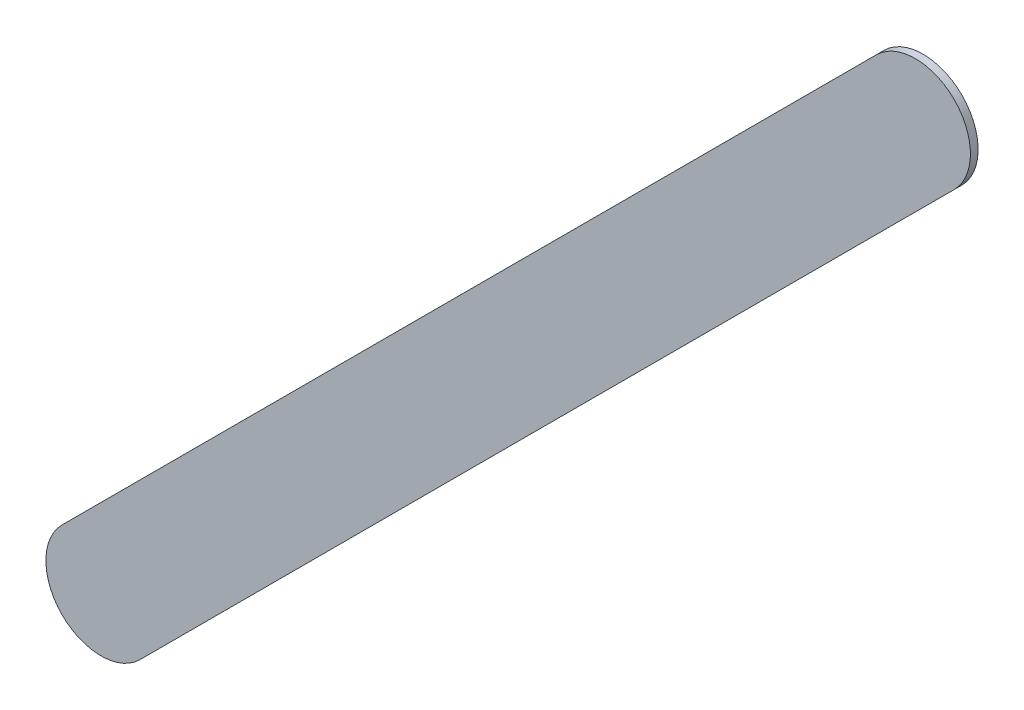
ISO-10303-21;
HEADER;
FILE_DESCRIPTION(('STEP AP214'),'2;1');
FILE_NAME('part.step','',(''),(''),'','','');
FILE_SCHEMA(('AUTOMOTIVE_DESIGN { 1 0 10303 214 1 1 1 1 }'));
ENDSEC;
DATA;
#1=APPLICATION_CONTEXT('core data for automotive mechanical design processes');
#2=APPLICATION_PROTOCOL_DEFINITION('international standard','automotive_design',2000,#1);
#3=PRODUCT_CONTEXT('',#1,'mechanical');
#4=PRODUCT('Part','Part','',(#3));
#5=PRODUCT_RELATED_PRODUCT_CATEGORY('part','',(#4));
#6=PRODUCT_DEFINITION_FORMATION('','',#4);
#7=PRODUCT_DEFINITION_CONTEXT('part definition',#1,'design');
#8=PRODUCT_DEFINITION('design','',#6,#7);
#9=PRODUCT_DEFINITION_SHAPE('','',#8);
#10=(LENGTH_UNIT() NAMED_UNIT(*) SI_UNIT(.MILLI.,.METRE.));
#11=(NAMED_UNIT(*) PLANE_ANGLE_UNIT() SI_UNIT($,.RADIAN.));
#12=(NAMED_UNIT(*) SI_UNIT($,.STERADIAN.) SOLID_ANGLE_UNIT());
#13=UNCERTAINTY_MEASURE_WITH_UNIT(LENGTH_MEASURE(1.E-05),#10,'distance_accuracy_value','');
#14=(GEOMETRIC_REPRESENTATION_CONTEXT(3) GLOBAL_UNCERTAINTY_ASSIGNED_CONTEXT((#13)) GLOBAL_UNIT_ASSIGNED_CONTEXT((#10,
#11,#12)) REPRESENTATION_CONTEXT('',''));
#15=CARTESIAN_POINT('',(0.,0.,0.));
#16=DIRECTION('',(0.,0.,1.));
#17=DIRECTION('',(1.,0.,0.));
#18=AXIS2_PLACEMENT_3D('',#15,#16,#17);
#19=CARTESIAN_POINT('',(151.346776,-56.556776,1.635));
#20=DIRECTION('',(0.,0.,1.));
#21=DIRECTION('',(1.,0.,0.));
#22=AXIS2_PLACEMENT_3D('',#19,#20,#21);
#23=PLANE('',#22);
#24=DIRECTION('',(0.707106781186548,0.707106781186548,0.));
#25=VECTOR('',#24,1.);
#26=CARTESIAN_POINT('',(151.346776,-56.556776,1.635));
#27=LINE('',#26,#25);
#28=CARTESIAN_POINT('',(151.346776,-56.556776,1.635));
#29=VERTEX_POINT('',#28);
#30=CARTESIAN_POINT('',(155.046776,-52.856776,1.635));
#31=VERTEX_POINT('',#30);
#32=EDGE_CURVE('E71',#29,#31,#27,.T.);
#33=ORIENTED_EDGE('',*,*,#32,.T.);
#34=CARTESIAN_POINT('',(154.8699995,-52.6799995,1.635));
#35=DIRECTION('',(0.,0.,1.));
#36=DIRECTION('',(0.707106781186548,-0.707106781186548,0.));
#37=AXIS2_PLACEMENT_3D('',#34,#35,#36);
#38=CIRCLE('',#37,0.249999723809);
#39=CARTESIAN_POINT('',(154.693223,-52.503223,1.635));
#40=VERTEX_POINT('',#39);
#41=EDGE_CURVE('E69',#31,#40,#38,.T.);
#42=ORIENTED_EDGE('',*,*,#41,.T.);
#43=DIRECTION('',(-0.707106781186548,-0.707106781186548,0.));
#44=VECTOR('',#43,1.);
#45=CARTESIAN_POINT('',(154.693223,-52.503223,1.635));
#46=LINE('',#45,#44);
#47=CARTESIAN_POINT('',(150.993223,-56.203223,1.635));
#48=VERTEX_POINT('',#47);
#49=EDGE_CURVE('E56',#40,#48,#46,.T.);
#50=ORIENTED_EDGE('',*,*,#49,.T.);
#51=CARTESIAN_POINT('',(151.1699995,-56.3799995,1.635));
#52=DIRECTION('',(0.,0.,1.));
#53=DIRECTION('',(-0.707106781186548,0.707106781186548,0.));
#54=AXIS2_PLACEMENT_3D('',#51,#52,#53);
#55=CIRCLE('',#54,0.249999723809);
#56=EDGE_CURVE('E11',#48,#29,#55,.T.);
#57=ORIENTED_EDGE('',*,*,#56,.T.);
#58=EDGE_LOOP('',(#33,#42,#50,#57));
#59=FACE_BOUND('',#58,.T.);
#60=ADVANCED_FACE('F17',(#59),#23,.T.);
#61=CARTESIAN_POINT('',(151.346776,-56.556776,1.6));
#62=DIRECTION('',(0.,0.,1.));
#63=DIRECTION('',(1.,0.,0.));
#64=AXIS2_PLACEMENT_3D('',#61,#62,#63);
#65=PLANE('',#64);
#66=CARTESIAN_POINT('',(151.1699995,-56.3799995,1.6));
#67=DIRECTION('',(0.,0.,1.));
#68=DIRECTION('',(-0.707106781186548,0.707106781186548,0.));
#69=AXIS2_PLACEMENT_3D('',#66,#67,#68);
#70=CIRCLE('',#69,0.249999723809);
#71=CARTESIAN_POINT('',(150.993223,-56.203223,1.6));
#72=VERTEX_POINT('',#71);
#73=CARTESIAN_POINT('',(151.346776,-56.556776,1.6));
#74=VERTEX_POINT('',#73);
#75=EDGE_CURVE('E20',#72,#74,#70,.T.);
#76=ORIENTED_EDGE('',*,*,#75,.F.);
#77=DIRECTION('',(-0.707106781186548,-0.707106781186548,0.));
#78=VECTOR('',#77,1.);
#79=CARTESIAN_POINT('',(154.693223,-52.503223,1.6));
#80=LINE('',#79,#78);
#81=CARTESIAN_POINT('',(154.693223,-52.503223,1.6));
#82=VERTEX_POINT('',#81);
#83=EDGE_CURVE('E76',#82,#72,#80,.T.);
#84=ORIENTED_EDGE('',*,*,#83,.F.);
#85=CARTESIAN_POINT('',(154.8699995,-52.6799995,1.6));
#86=DIRECTION('',(0.,0.,1.));
#87=DIRECTION('',(0.707106781186548,-0.707106781186548,0.));
#88=AXIS2_PLACEMENT_3D('',#85,#86,#87);
#89=CIRCLE('',#88,0.249999723809);
#90=CARTESIAN_POINT('',(155.046776,-52.856776,1.6));
#91=VERTEX_POINT('',#90);
#92=EDGE_CURVE('E80',#91,#82,#89,.T.);
#93=ORIENTED_EDGE('',*,*,#92,.F.);
#94=DIRECTION('',(0.707106781186548,0.707106781186548,0.));
#95=VECTOR('',#94,1.);
#96=CARTESIAN_POINT('',(151.346776,-56.556776,1.6));
#97=LINE('',#96,#95);
#98=EDGE_CURVE('E99',#74,#91,#97,.T.);
#99=ORIENTED_EDGE('',*,*,#98,.F.);
#100=EDGE_LOOP('',(#76,#84,#93,#99));
#101=FACE_BOUND('',#100,.T.);
#102=ADVANCED_FACE('F154',(#101),#65,.F.);
#103=CARTESIAN_POINT('',(151.1699995,-56.3799995,1.6));
#104=DIRECTION('',(0.,0.,-1.));
#105=DIRECTION('',(-0.707106781186548,0.707106781186548,0.));
#106=AXIS2_PLACEMENT_3D('',#103,#104,#105);
#107=CYLINDRICAL_SURFACE('',#106,0.249999723809);
#108=ORIENTED_EDGE('',*,*,#75,.T.);
#109=DIRECTION('',(0.,0.,1.));
#110=VECTOR('',#109,1.);
#111=CARTESIAN_POINT('',(151.346776,-56.556776,1.6));
#112=LINE('',#111,#110);
#113=EDGE_CURVE('E87',#74,#29,#112,.T.);
#114=ORIENTED_EDGE('',*,*,#113,.T.);
#115=ORIENTED_EDGE('',*,*,#56,.F.);
#116=DIRECTION('',(0.,0.,1.));
#117=VECTOR('',#116,1.);
#118=CARTESIAN_POINT('',(150.993223,-56.203223,1.6));
#119=LINE('',#118,#117);
#120=EDGE_CURVE('E63',#72,#48,#119,.T.);
#121=ORIENTED_EDGE('',*,*,#120,.F.);
#122=EDGE_LOOP('',(#108,#114,#115,#121));
#123=FACE_BOUND('',#122,.T.);
#124=ADVANCED_FACE('F149',(#123),#107,.T.);
#125=CARTESIAN_POINT('',(154.693223,-52.503223,1.6));
#126=DIRECTION('',(0.707106781186548,-0.707106781186548,0.));
#127=DIRECTION('',(0.,0.,-1.));
#128=AXIS2_PLACEMENT_3D('',#125,#126,#127);
#129=PLANE('',#128);
#130=ORIENTED_EDGE('',*,*,#83,.T.);
#131=ORIENTED_EDGE('',*,*,#120,.T.);
#132=ORIENTED_EDGE('',*,*,#49,.F.);
#133=DIRECTION('',(0.,0.,1.));
#134=VECTOR('',#133,1.);
#135=CARTESIAN_POINT('',(154.693223,-52.503223,1.6));
#136=LINE('',#135,#134);
#137=EDGE_CURVE('E61',#82,#40,#136,.T.);
#138=ORIENTED_EDGE('',*,*,#137,.F.);
#139=EDGE_LOOP('',(#130,#131,#132,#138));
#140=FACE_BOUND('',#139,.T.);
#141=ADVANCED_FACE('F59',(#140),#129,.F.);
#142=CARTESIAN_POINT('',(154.8699995,-52.6799995,1.6));
#143=DIRECTION('',(0.,0.,-1.));
#144=DIRECTION('',(0.707106781186548,-0.707106781186548,0.));
#145=AXIS2_PLACEMENT_3D('',#142,#143,#144);
#146=CYLINDRICAL_SURFACE('',#145,0.249999723809);
#147=ORIENTED_EDGE('',*,*,#92,.T.);
#148=ORIENTED_EDGE('',*,*,#137,.T.);
#149=ORIENTED_EDGE('',*,*,#41,.F.);
#150=DIRECTION('',(0.,0.,1.));
#151=VECTOR('',#150,1.);
#152=CARTESIAN_POINT('',(155.046776,-52.856776,1.6));
#153=LINE('',#152,#151);
#154=EDGE_CURVE('E94',#91,#31,#153,.T.);
#155=ORIENTED_EDGE('',*,*,#154,.F.);
#156=EDGE_LOOP('',(#147,#148,#149,#155));
#157=FACE_BOUND('',#156,.T.);
#158=ADVANCED_FACE('F78',(#157),#146,.T.);
#159=CARTESIAN_POINT('',(151.346776,-56.556776,1.6));
#160=DIRECTION('',(-0.707106781186548,0.707106781186548,0.));
#161=DIRECTION('',(0.,0.,1.));
#162=AXIS2_PLACEMENT_3D('',#159,#160,#161);
#163=PLANE('',#162);
#164=ORIENTED_EDGE('',*,*,#98,.T.);
#165=ORIENTED_EDGE('',*,*,#154,.T.);
#166=ORIENTED_EDGE('',*,*,#32,.F.);
#167=ORIENTED_EDGE('',*,*,#113,.F.);
#168=EDGE_LOOP('',(#164,#165,#166,#167));
#169=FACE_BOUND('',#168,.T.);
#170=ADVANCED_FACE('F133',(#169),#163,.F.);
#171=CLOSED_SHELL('',(#60,#102,#124,#141,#158,#170));
#172=MANIFOLD_SOLID_BREP('B1',#171);
#173=ADVANCED_BREP_SHAPE_REPRESENTATION('',(#18,#172),#14);
#174=SHAPE_DEFINITION_REPRESENTATION(#9,#173);
ENDSEC;
END-ISO-10303-21;
